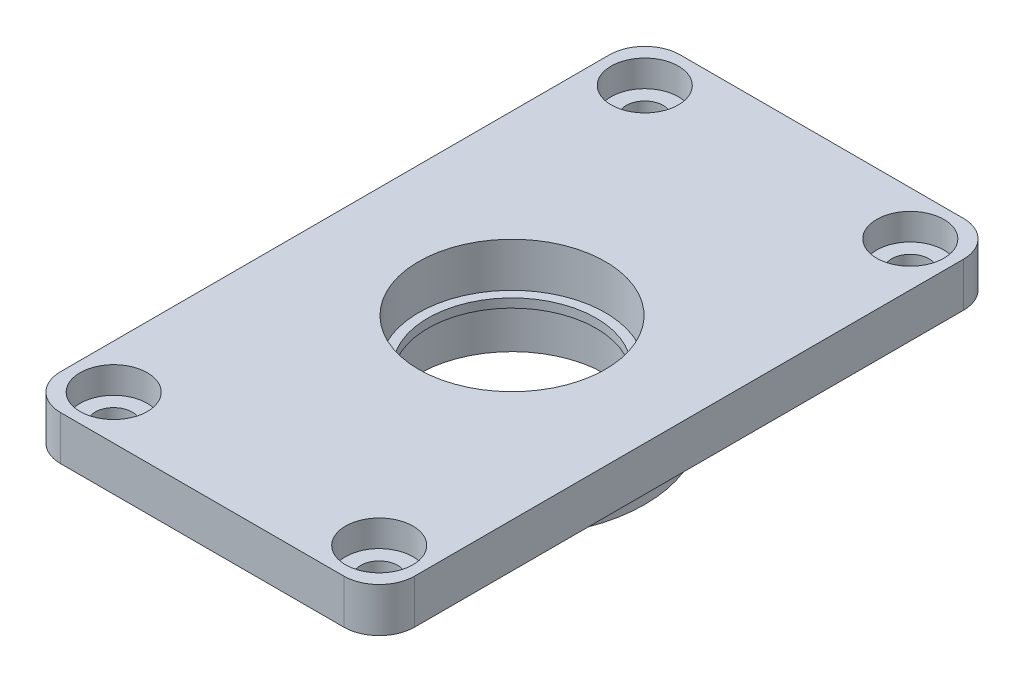
ISO-10303-21;
HEADER;
FILE_DESCRIPTION(('STEP AP214'),'2;1');
FILE_NAME('part.step','',(''),(''),'','','');
FILE_SCHEMA(('AUTOMOTIVE_DESIGN { 1 0 10303 214 1 1 1 1 }'));
ENDSEC;
DATA;
#1=APPLICATION_CONTEXT('core data for automotive mechanical design processes');
#2=APPLICATION_PROTOCOL_DEFINITION('international standard','automotive_design',2000,#1);
#3=PRODUCT_CONTEXT('',#1,'mechanical');
#4=PRODUCT('Part','Part','',(#3));
#5=PRODUCT_RELATED_PRODUCT_CATEGORY('part','',(#4));
#6=PRODUCT_DEFINITION_FORMATION('','',#4);
#7=PRODUCT_DEFINITION_CONTEXT('part definition',#1,'design');
#8=PRODUCT_DEFINITION('design','',#6,#7);
#9=PRODUCT_DEFINITION_SHAPE('','',#8);
#10=(LENGTH_UNIT() NAMED_UNIT(*) SI_UNIT(.MILLI.,.METRE.));
#11=(NAMED_UNIT(*) PLANE_ANGLE_UNIT() SI_UNIT($,.RADIAN.));
#12=(NAMED_UNIT(*) SI_UNIT($,.STERADIAN.) SOLID_ANGLE_UNIT());
#13=UNCERTAINTY_MEASURE_WITH_UNIT(LENGTH_MEASURE(1.E-05),#10,'distance_accuracy_value','');
#14=(GEOMETRIC_REPRESENTATION_CONTEXT(3) GLOBAL_UNCERTAINTY_ASSIGNED_CONTEXT((#13)) GLOBAL_UNIT_ASSIGNED_CONTEXT((#10,
#11,#12)) REPRESENTATION_CONTEXT('',''));
#15=CARTESIAN_POINT('',(0.,0.,0.));
#16=DIRECTION('',(0.,0.,1.));
#17=DIRECTION('',(1.,0.,0.));
#18=AXIS2_PLACEMENT_3D('',#15,#16,#17);
#19=CARTESIAN_POINT('',(15.,11.,-30.));
#20=DIRECTION('',(0.,-1.,0.));
#21=DIRECTION('',(0.,0.,-1.));
#22=AXIS2_PLACEMENT_3D('',#19,#20,#21);
#23=CYLINDRICAL_SURFACE('',#22,2.1);
#24=CARTESIAN_POINT('',(15.,6.00000000000001,-30.));
#25=DIRECTION('',(0.,1.,0.));
#26=DIRECTION('',(0.,0.,1.));
#27=AXIS2_PLACEMENT_3D('',#24,#25,#26);
#28=CIRCLE('',#27,2.1);
#29=CARTESIAN_POINT('',(15.,6.00000000000001,-27.9));
#30=VERTEX_POINT('',#29);
#31=EDGE_CURVE('E238',#30,#30,#28,.T.);
#32=ORIENTED_EDGE('',*,*,#31,.F.);
#33=EDGE_LOOP('',(#32));
#34=FACE_BOUND('',#33,.T.);
#35=CARTESIAN_POINT('',(15.,8.,-30.));
#36=DIRECTION('',(0.,1.,0.));
#37=DIRECTION('',(0.,0.,1.));
#38=AXIS2_PLACEMENT_3D('',#35,#36,#37);
#39=CIRCLE('',#38,2.1);
#40=CARTESIAN_POINT('',(15.,8.,-27.9));
#41=VERTEX_POINT('',#40);
#42=EDGE_CURVE('E180',#41,#41,#39,.T.);
#43=ORIENTED_EDGE('',*,*,#42,.T.);
#44=EDGE_LOOP('',(#43));
#45=FACE_BOUND('',#44,.T.);
#46=ADVANCED_FACE('F35',(#34,#45),#23,.F.);
#47=CARTESIAN_POINT('',(-15.,11.,-30.));
#48=DIRECTION('',(0.,-1.,0.));
#49=DIRECTION('',(0.,0.,-1.));
#50=AXIS2_PLACEMENT_3D('',#47,#48,#49);
#51=CYLINDRICAL_SURFACE('',#50,2.1);
#52=CARTESIAN_POINT('',(-15.,6.00000000000001,-30.));
#53=DIRECTION('',(0.,1.,0.));
#54=DIRECTION('',(0.,0.,1.));
#55=AXIS2_PLACEMENT_3D('',#52,#53,#54);
#56=CIRCLE('',#55,2.1);
#57=CARTESIAN_POINT('',(-15.,6.00000000000001,-27.9));
#58=VERTEX_POINT('',#57);
#59=EDGE_CURVE('E236',#58,#58,#56,.T.);
#60=ORIENTED_EDGE('',*,*,#59,.F.);
#61=EDGE_LOOP('',(#60));
#62=FACE_BOUND('',#61,.T.);
#63=CARTESIAN_POINT('',(-15.,8.,-30.));
#64=DIRECTION('',(0.,1.,0.));
#65=DIRECTION('',(0.,0.,1.));
#66=AXIS2_PLACEMENT_3D('',#63,#64,#65);
#67=CIRCLE('',#66,2.1);
#68=CARTESIAN_POINT('',(-15.,8.,-27.9));
#69=VERTEX_POINT('',#68);
#70=EDGE_CURVE('E177',#69,#69,#67,.T.);
#71=ORIENTED_EDGE('',*,*,#70,.T.);
#72=EDGE_LOOP('',(#71));
#73=FACE_BOUND('',#72,.T.);
#74=ADVANCED_FACE('F301',(#62,#73),#51,.F.);
#75=CARTESIAN_POINT('',(0.,0.,0.));
#76=DIRECTION('',(0.,1.,0.));
#77=DIRECTION('',(0.,0.,1.));
#78=AXIS2_PLACEMENT_3D('',#75,#76,#77);
#79=PLANE('',#78);
#80=CARTESIAN_POINT('',(0.,0.,0.));
#81=DIRECTION('',(0.,-1.,0.));
#82=DIRECTION('',(0.,0.,-1.));
#83=AXIS2_PLACEMENT_3D('',#80,#81,#82);
#84=CIRCLE('',#83,10.55);
#85=CARTESIAN_POINT('',(0.,0.,-10.55));
#86=VERTEX_POINT('',#85);
#87=EDGE_CURVE('E201',#86,#86,#84,.T.);
#88=ORIENTED_EDGE('',*,*,#87,.F.);
#89=EDGE_LOOP('',(#88));
#90=FACE_BOUND('',#89,.T.);
#91=CARTESIAN_POINT('',(0.,0.,0.));
#92=DIRECTION('',(0.,-1.,0.));
#93=DIRECTION('',(0.,0.,-1.));
#94=AXIS2_PLACEMENT_3D('',#91,#92,#93);
#95=CIRCLE('',#94,15.);
#96=CARTESIAN_POINT('',(0.,0.,-15.));
#97=VERTEX_POINT('',#96);
#98=EDGE_CURVE('E197',#97,#97,#95,.T.);
#99=ORIENTED_EDGE('',*,*,#98,.T.);
#100=EDGE_LOOP('',(#99));
#101=FACE_BOUND('',#100,.T.);
#102=ADVANCED_FACE('F308',(#90,#101),#79,.F.);
#103=CARTESIAN_POINT('',(0.,0.,0.));
#104=DIRECTION('',(0.,1.,0.));
#105=DIRECTION('',(0.,0.,1.));
#106=AXIS2_PLACEMENT_3D('',#103,#104,#105);
#107=CYLINDRICAL_SURFACE('',#106,9.5);
#108=CARTESIAN_POINT('',(0.,6.,0.));
#109=DIRECTION('',(0.,1.,0.));
#110=DIRECTION('',(0.,0.,1.));
#111=AXIS2_PLACEMENT_3D('',#108,#109,#110);
#112=CIRCLE('',#111,9.5);
#113=CARTESIAN_POINT('',(0.,6.,9.5));
#114=VERTEX_POINT('',#113);
#115=EDGE_CURVE('E161',#114,#114,#112,.F.);
#116=ORIENTED_EDGE('',*,*,#115,.F.);
#117=EDGE_LOOP('',(#116));
#118=FACE_BOUND('',#117,.T.);
#119=CARTESIAN_POINT('',(0.,5.,0.));
#120=DIRECTION('',(0.,-1.,0.));
#121=DIRECTION('',(0.,0.,-1.));
#122=AXIS2_PLACEMENT_3D('',#119,#120,#121);
#123=CIRCLE('',#122,9.5);
#124=CARTESIAN_POINT('',(0.,5.,-9.5));
#125=VERTEX_POINT('',#124);
#126=EDGE_CURVE('E173',#125,#125,#123,.F.);
#127=ORIENTED_EDGE('',*,*,#126,.F.);
#128=EDGE_LOOP('',(#127));
#129=FACE_BOUND('',#128,.T.);
#130=ADVANCED_FACE('F214',(#118,#129),#107,.F.);
#131=CARTESIAN_POINT('',(0.,11.,0.));
#132=DIRECTION('',(0.,1.,0.));
#133=DIRECTION('',(0.,0.,1.));
#134=AXIS2_PLACEMENT_3D('',#131,#132,#133);
#135=PLANE('',#134);
#136=CARTESIAN_POINT('',(-15.,11.,30.));
#137=DIRECTION('',(0.,1.,0.));
#138=DIRECTION('',(0.,0.,-1.));
#139=AXIS2_PLACEMENT_3D('',#136,#137,#138);
#140=CIRCLE('',#139,3.79999999999998);
#141=CARTESIAN_POINT('',(-15.,11.,26.2));
#142=VERTEX_POINT('',#141);
#143=EDGE_CURVE('E256',#142,#142,#140,.T.);
#144=ORIENTED_EDGE('',*,*,#143,.F.);
#145=EDGE_LOOP('',(#144));
#146=FACE_BOUND('',#145,.T.);
#147=CARTESIAN_POINT('',(15.,11.,30.));
#148=DIRECTION('',(0.,1.,0.));
#149=DIRECTION('',(0.,0.,-1.));
#150=AXIS2_PLACEMENT_3D('',#147,#148,#149);
#151=CIRCLE('',#150,3.79999999999999);
#152=CARTESIAN_POINT('',(15.,11.,26.2));
#153=VERTEX_POINT('',#152);
#154=EDGE_CURVE('E262',#153,#153,#151,.T.);
#155=ORIENTED_EDGE('',*,*,#154,.F.);
#156=EDGE_LOOP('',(#155));
#157=FACE_BOUND('',#156,.T.);
#158=CARTESIAN_POINT('',(15.,11.,-30.));
#159=DIRECTION('',(0.,1.,0.));
#160=DIRECTION('',(0.,0.,1.));
#161=AXIS2_PLACEMENT_3D('',#158,#159,#160);
#162=CIRCLE('',#161,3.8);
#163=CARTESIAN_POINT('',(15.,11.,-26.2));
#164=VERTEX_POINT('',#163);
#165=EDGE_CURVE('E268',#164,#164,#162,.T.);
#166=ORIENTED_EDGE('',*,*,#165,.F.);
#167=EDGE_LOOP('',(#166));
#168=FACE_BOUND('',#167,.T.);
#169=CARTESIAN_POINT('',(-15.,11.,-30.));
#170=DIRECTION('',(0.,1.,0.));
#171=DIRECTION('',(0.,0.,1.));
#172=AXIS2_PLACEMENT_3D('',#169,#170,#171);
#173=CIRCLE('',#172,3.8);
#174=CARTESIAN_POINT('',(-15.,11.,-26.2));
#175=VERTEX_POINT('',#174);
#176=EDGE_CURVE('E250',#175,#175,#173,.T.);
#177=ORIENTED_EDGE('',*,*,#176,.F.);
#178=EDGE_LOOP('',(#177));
#179=FACE_BOUND('',#178,.T.);
#180=CARTESIAN_POINT('',(0.,11.,0.));
#181=DIRECTION('',(0.,1.,0.));
#182=DIRECTION('',(0.,0.,1.));
#183=AXIS2_PLACEMENT_3D('',#180,#181,#182);
#184=CIRCLE('',#183,10.55);
#185=CARTESIAN_POINT('',(0.,11.,10.55));
#186=VERTEX_POINT('',#185);
#187=EDGE_CURVE('E168',#186,#186,#184,.T.);
#188=ORIENTED_EDGE('',*,*,#187,.F.);
#189=EDGE_LOOP('',(#188));
#190=FACE_BOUND('',#189,.T.);
#191=DIRECTION('',(0.,0.,1.));
#192=VECTOR('',#191,1.);
#193=CARTESIAN_POINT('',(-20.,11.,-35.));
#194=LINE('',#193,#192);
#195=CARTESIAN_POINT('',(-20.,11.,-31.));
#196=VERTEX_POINT('',#195);
#197=CARTESIAN_POINT('',(-20.,11.,31.));
#198=VERTEX_POINT('',#197);
#199=EDGE_CURVE('E132',#196,#198,#194,.T.);
#200=ORIENTED_EDGE('',*,*,#199,.T.);
#201=CARTESIAN_POINT('',(-16.,11.,31.));
#202=DIRECTION('',(0.,1.,0.));
#203=DIRECTION('',(0.,0.,1.));
#204=AXIS2_PLACEMENT_3D('',#201,#202,#203);
#205=CIRCLE('',#204,4.);
#206=CARTESIAN_POINT('',(-16.,11.,35.));
#207=VERTEX_POINT('',#206);
#208=EDGE_CURVE('E150',#198,#207,#205,.T.);
#209=ORIENTED_EDGE('',*,*,#208,.T.);
#210=DIRECTION('',(1.,0.,0.));
#211=VECTOR('',#210,1.);
#212=CARTESIAN_POINT('',(-20.,11.,35.));
#213=LINE('',#212,#211);
#214=CARTESIAN_POINT('',(16.,11.,35.));
#215=VERTEX_POINT('',#214);
#216=EDGE_CURVE('E128',#207,#215,#213,.T.);
#217=ORIENTED_EDGE('',*,*,#216,.T.);
#218=CARTESIAN_POINT('',(16.,11.,31.));
#219=DIRECTION('',(0.,1.,0.));
#220=DIRECTION('',(0.,0.,1.));
#221=AXIS2_PLACEMENT_3D('',#218,#219,#220);
#222=CIRCLE('',#221,4.);
#223=CARTESIAN_POINT('',(20.,11.,31.));
#224=VERTEX_POINT('',#223);
#225=EDGE_CURVE('E127',#215,#224,#222,.T.);
#226=ORIENTED_EDGE('',*,*,#225,.T.);
#227=DIRECTION('',(0.,0.,-1.));
#228=VECTOR('',#227,1.);
#229=CARTESIAN_POINT('',(20.,11.,-35.));
#230=LINE('',#229,#228);
#231=CARTESIAN_POINT('',(20.,11.,-31.));
#232=VERTEX_POINT('',#231);
#233=EDGE_CURVE('E159',#224,#232,#230,.T.);
#234=ORIENTED_EDGE('',*,*,#233,.T.);
#235=CARTESIAN_POINT('',(16.,11.,-31.));
#236=DIRECTION('',(0.,1.,0.));
#237=DIRECTION('',(0.,0.,1.));
#238=AXIS2_PLACEMENT_3D('',#235,#236,#237);
#239=CIRCLE('',#238,4.);
#240=CARTESIAN_POINT('',(16.,11.,-35.));
#241=VERTEX_POINT('',#240);
#242=EDGE_CURVE('E56',#232,#241,#239,.T.);
#243=ORIENTED_EDGE('',*,*,#242,.T.);
#244=DIRECTION('',(-1.,0.,0.));
#245=VECTOR('',#244,1.);
#246=CARTESIAN_POINT('',(-20.,11.,-35.));
#247=LINE('',#246,#245);
#248=CARTESIAN_POINT('',(-16.,11.,-35.));
#249=VERTEX_POINT('',#248);
#250=EDGE_CURVE('E160',#241,#249,#247,.T.);
#251=ORIENTED_EDGE('',*,*,#250,.T.);
#252=CARTESIAN_POINT('',(-16.,11.,-31.));
#253=DIRECTION('',(0.,1.,0.));
#254=DIRECTION('',(0.,0.,1.));
#255=AXIS2_PLACEMENT_3D('',#252,#253,#254);
#256=CIRCLE('',#255,4.);
#257=EDGE_CURVE('E146',#249,#196,#256,.T.);
#258=ORIENTED_EDGE('',*,*,#257,.T.);
#259=EDGE_LOOP('',(#200,#209,#217,#226,#234,#243,#251,#258));
#260=FACE_BOUND('',#259,.T.);
#261=ADVANCED_FACE('F212',(#146,#157,#168,#179,#190,#260),#135,.T.);
#262=CARTESIAN_POINT('',(20.,11.,-35.));
#263=DIRECTION('',(-1.,0.,0.));
#264=DIRECTION('',(0.,0.,1.));
#265=AXIS2_PLACEMENT_3D('',#262,#263,#264);
#266=PLANE('',#265);
#267=ORIENTED_EDGE('',*,*,#233,.F.);
#268=DIRECTION('',(0.,-1.,0.));
#269=VECTOR('',#268,1.);
#270=CARTESIAN_POINT('',(20.,11.,31.));
#271=LINE('',#270,#269);
#272=CARTESIAN_POINT('',(20.,6.00000000000001,31.));
#273=VERTEX_POINT('',#272);
#274=EDGE_CURVE('E154',#224,#273,#271,.T.);
#275=ORIENTED_EDGE('',*,*,#274,.T.);
#276=DIRECTION('',(0.,0.,1.));
#277=VECTOR('',#276,1.);
#278=CARTESIAN_POINT('',(20.,6.00000000000001,0.));
#279=LINE('',#278,#277);
#280=CARTESIAN_POINT('',(20.,6.00000000000001,-31.));
#281=VERTEX_POINT('',#280);
#282=EDGE_CURVE('E107',#281,#273,#279,.T.);
#283=ORIENTED_EDGE('',*,*,#282,.F.);
#284=DIRECTION('',(0.,-1.,0.));
#285=VECTOR('',#284,1.);
#286=CARTESIAN_POINT('',(20.,11.,-31.));
#287=LINE('',#286,#285);
#288=EDGE_CURVE('E152',#281,#232,#287,.F.);
#289=ORIENTED_EDGE('',*,*,#288,.T.);
#290=EDGE_LOOP('',(#267,#275,#283,#289));
#291=FACE_BOUND('',#290,.T.);
#292=ADVANCED_FACE('F157',(#291),#266,.F.);
#293=CARTESIAN_POINT('',(-20.,11.,-35.));
#294=DIRECTION('',(0.,0.,1.));
#295=DIRECTION('',(1.,0.,0.));
#296=AXIS2_PLACEMENT_3D('',#293,#294,#295);
#297=PLANE('',#296);
#298=ORIENTED_EDGE('',*,*,#250,.F.);
#299=DIRECTION('',(0.,-1.,0.));
#300=VECTOR('',#299,1.);
#301=CARTESIAN_POINT('',(16.,11.,-35.));
#302=LINE('',#301,#300);
#303=CARTESIAN_POINT('',(16.,6.00000000000001,-35.));
#304=VERTEX_POINT('',#303);
#305=EDGE_CURVE('E11',#241,#304,#302,.T.);
#306=ORIENTED_EDGE('',*,*,#305,.T.);
#307=DIRECTION('',(1.,0.,0.));
#308=VECTOR('',#307,1.);
#309=CARTESIAN_POINT('',(0.,6.00000000000001,-35.));
#310=LINE('',#309,#308);
#311=CARTESIAN_POINT('',(-16.,6.00000000000001,-35.));
#312=VERTEX_POINT('',#311);
#313=EDGE_CURVE('E228',#312,#304,#310,.T.);
#314=ORIENTED_EDGE('',*,*,#313,.F.);
#315=DIRECTION('',(0.,-1.,0.));
#316=VECTOR('',#315,1.);
#317=CARTESIAN_POINT('',(-16.,11.,-35.));
#318=LINE('',#317,#316);
#319=EDGE_CURVE('E43',#312,#249,#318,.F.);
#320=ORIENTED_EDGE('',*,*,#319,.T.);
#321=EDGE_LOOP('',(#298,#306,#314,#320));
#322=FACE_BOUND('',#321,.T.);
#323=ADVANCED_FACE('F330',(#322),#297,.F.);
#324=CARTESIAN_POINT('',(-20.,11.,-35.));
#325=DIRECTION('',(1.,0.,0.));
#326=DIRECTION('',(0.,0.,-1.));
#327=AXIS2_PLACEMENT_3D('',#324,#325,#326);
#328=PLANE('',#327);
#329=DIRECTION('',(0.,0.,-1.));
#330=VECTOR('',#329,1.);
#331=CARTESIAN_POINT('',(-20.,6.00000000000001,0.));
#332=LINE('',#331,#330);
#333=CARTESIAN_POINT('',(-20.,6.00000000000001,31.));
#334=VERTEX_POINT('',#333);
#335=CARTESIAN_POINT('',(-20.,6.00000000000001,-31.));
#336=VERTEX_POINT('',#335);
#337=EDGE_CURVE('E123',#334,#336,#332,.T.);
#338=ORIENTED_EDGE('',*,*,#337,.F.);
#339=DIRECTION('',(0.,-1.,0.));
#340=VECTOR('',#339,1.);
#341=CARTESIAN_POINT('',(-20.,11.,31.));
#342=LINE('',#341,#340);
#343=EDGE_CURVE('E144',#334,#198,#342,.F.);
#344=ORIENTED_EDGE('',*,*,#343,.T.);
#345=ORIENTED_EDGE('',*,*,#199,.F.);
#346=DIRECTION('',(0.,-1.,0.));
#347=VECTOR('',#346,1.);
#348=CARTESIAN_POINT('',(-20.,11.,-31.));
#349=LINE('',#348,#347);
#350=EDGE_CURVE('E141',#196,#336,#349,.T.);
#351=ORIENTED_EDGE('',*,*,#350,.T.);
#352=EDGE_LOOP('',(#338,#344,#345,#351));
#353=FACE_BOUND('',#352,.T.);
#354=ADVANCED_FACE('F227',(#353),#328,.F.);
#355=CARTESIAN_POINT('',(-20.,11.,35.));
#356=DIRECTION('',(0.,0.,-1.));
#357=DIRECTION('',(-1.,0.,0.));
#358=AXIS2_PLACEMENT_3D('',#355,#356,#357);
#359=PLANE('',#358);
#360=ORIENTED_EDGE('',*,*,#216,.F.);
#361=DIRECTION('',(0.,-1.,0.));
#362=VECTOR('',#361,1.);
#363=CARTESIAN_POINT('',(-16.,11.,35.));
#364=LINE('',#363,#362);
#365=CARTESIAN_POINT('',(-16.,6.00000000000001,35.));
#366=VERTEX_POINT('',#365);
#367=EDGE_CURVE('E122',#207,#366,#364,.T.);
#368=ORIENTED_EDGE('',*,*,#367,.T.);
#369=DIRECTION('',(-1.,0.,0.));
#370=VECTOR('',#369,1.);
#371=CARTESIAN_POINT('',(0.,6.00000000000001,35.));
#372=LINE('',#371,#370);
#373=CARTESIAN_POINT('',(16.,6.00000000000001,35.));
#374=VERTEX_POINT('',#373);
#375=EDGE_CURVE('E105',#374,#366,#372,.T.);
#376=ORIENTED_EDGE('',*,*,#375,.F.);
#377=DIRECTION('',(0.,-1.,0.));
#378=VECTOR('',#377,1.);
#379=CARTESIAN_POINT('',(16.,11.,35.));
#380=LINE('',#379,#378);
#381=EDGE_CURVE('E119',#374,#215,#380,.F.);
#382=ORIENTED_EDGE('',*,*,#381,.T.);
#383=EDGE_LOOP('',(#360,#368,#376,#382));
#384=FACE_BOUND('',#383,.T.);
#385=ADVANCED_FACE('F118',(#384),#359,.F.);
#386=CARTESIAN_POINT('',(-15.,11.,30.));
#387=DIRECTION('',(0.,-1.,0.));
#388=DIRECTION('',(0.,0.,-1.));
#389=AXIS2_PLACEMENT_3D('',#386,#387,#388);
#390=CYLINDRICAL_SURFACE('',#389,2.1);
#391=CARTESIAN_POINT('',(-15.,8.,30.));
#392=DIRECTION('',(0.,-1.,0.));
#393=DIRECTION('',(0.,0.,-1.));
#394=AXIS2_PLACEMENT_3D('',#391,#392,#393);
#395=CIRCLE('',#394,2.1);
#396=CARTESIAN_POINT('',(-15.,8.,27.9));
#397=VERTEX_POINT('',#396);
#398=EDGE_CURVE('E135',#397,#397,#395,.T.);
#399=ORIENTED_EDGE('',*,*,#398,.F.);
#400=EDGE_LOOP('',(#399));
#401=FACE_BOUND('',#400,.T.);
#402=CARTESIAN_POINT('',(-15.,6.00000000000001,30.));
#403=DIRECTION('',(0.,1.,0.));
#404=DIRECTION('',(0.,0.,1.));
#405=AXIS2_PLACEMENT_3D('',#402,#403,#404);
#406=CIRCLE('',#405,2.1);
#407=CARTESIAN_POINT('',(-15.,6.00000000000001,32.1));
#408=VERTEX_POINT('',#407);
#409=EDGE_CURVE('E188',#408,#408,#406,.T.);
#410=ORIENTED_EDGE('',*,*,#409,.F.);
#411=EDGE_LOOP('',(#410));
#412=FACE_BOUND('',#411,.T.);
#413=ADVANCED_FACE('F318',(#401,#412),#390,.F.);
#414=CARTESIAN_POINT('',(15.,11.,30.));
#415=DIRECTION('',(0.,-1.,0.));
#416=DIRECTION('',(0.,0.,-1.));
#417=AXIS2_PLACEMENT_3D('',#414,#415,#416);
#418=CYLINDRICAL_SURFACE('',#417,2.1);
#419=CARTESIAN_POINT('',(15.,8.,30.));
#420=DIRECTION('',(0.,-1.,0.));
#421=DIRECTION('',(0.,0.,-1.));
#422=AXIS2_PLACEMENT_3D('',#419,#420,#421);
#423=CIRCLE('',#422,2.1);
#424=CARTESIAN_POINT('',(15.,8.,27.9));
#425=VERTEX_POINT('',#424);
#426=EDGE_CURVE('E183',#425,#425,#423,.T.);
#427=ORIENTED_EDGE('',*,*,#426,.F.);
#428=EDGE_LOOP('',(#427));
#429=FACE_BOUND('',#428,.T.);
#430=CARTESIAN_POINT('',(15.,6.00000000000001,30.));
#431=DIRECTION('',(0.,1.,0.));
#432=DIRECTION('',(0.,0.,1.));
#433=AXIS2_PLACEMENT_3D('',#430,#431,#432);
#434=CIRCLE('',#433,2.1);
#435=CARTESIAN_POINT('',(15.,6.00000000000001,32.1));
#436=VERTEX_POINT('',#435);
#437=EDGE_CURVE('E231',#436,#436,#434,.T.);
#438=ORIENTED_EDGE('',*,*,#437,.F.);
#439=EDGE_LOOP('',(#438));
#440=FACE_BOUND('',#439,.T.);
#441=ADVANCED_FACE('F314',(#429,#440),#418,.F.);
#442=CARTESIAN_POINT('',(0.,6.,0.));
#443=DIRECTION('',(0.,1.,0.));
#444=DIRECTION('',(0.,0.,1.));
#445=AXIS2_PLACEMENT_3D('',#442,#443,#444);
#446=PLANE('',#445);
#447=CARTESIAN_POINT('',(0.,6.,0.));
#448=DIRECTION('',(0.,1.,0.));
#449=DIRECTION('',(0.,0.,1.));
#450=AXIS2_PLACEMENT_3D('',#447,#448,#449);
#451=CIRCLE('',#450,10.55);
#452=CARTESIAN_POINT('',(0.,6.,10.55));
#453=VERTEX_POINT('',#452);
#454=EDGE_CURVE('E165',#453,#453,#451,.T.);
#455=ORIENTED_EDGE('',*,*,#454,.T.);
#456=EDGE_LOOP('',(#455));
#457=FACE_BOUND('',#456,.T.);
#458=ORIENTED_EDGE('',*,*,#115,.T.);
#459=EDGE_LOOP('',(#458));
#460=FACE_BOUND('',#459,.T.);
#461=ADVANCED_FACE('F317',(#457,#460),#446,.T.);
#462=CARTESIAN_POINT('',(0.,6.,0.));
#463=DIRECTION('',(0.,1.,0.));
#464=DIRECTION('',(0.,0.,1.));
#465=AXIS2_PLACEMENT_3D('',#462,#463,#464);
#466=CYLINDRICAL_SURFACE('',#465,10.55);
#467=ORIENTED_EDGE('',*,*,#454,.F.);
#468=EDGE_LOOP('',(#467));
#469=FACE_BOUND('',#468,.T.);
#470=ORIENTED_EDGE('',*,*,#187,.T.);
#471=EDGE_LOOP('',(#470));
#472=FACE_BOUND('',#471,.T.);
#473=ADVANCED_FACE('F210',(#469,#472),#466,.F.);
#474=CARTESIAN_POINT('',(0.,5.,0.));
#475=DIRECTION('',(0.,-1.,0.));
#476=DIRECTION('',(0.,0.,-1.));
#477=AXIS2_PLACEMENT_3D('',#474,#475,#476);
#478=PLANE('',#477);
#479=CARTESIAN_POINT('',(0.,5.,0.));
#480=DIRECTION('',(0.,-1.,0.));
#481=DIRECTION('',(0.,0.,-1.));
#482=AXIS2_PLACEMENT_3D('',#479,#480,#481);
#483=CIRCLE('',#482,10.55);
#484=CARTESIAN_POINT('',(0.,5.,-10.55));
#485=VERTEX_POINT('',#484);
#486=EDGE_CURVE('E176',#485,#485,#483,.T.);
#487=ORIENTED_EDGE('',*,*,#486,.T.);
#488=EDGE_LOOP('',(#487));
#489=FACE_BOUND('',#488,.T.);
#490=ORIENTED_EDGE('',*,*,#126,.T.);
#491=EDGE_LOOP('',(#490));
#492=FACE_BOUND('',#491,.T.);
#493=ADVANCED_FACE('F496',(#489,#492),#478,.T.);
#494=CARTESIAN_POINT('',(0.,5.,0.));
#495=DIRECTION('',(0.,-1.,0.));
#496=DIRECTION('',(0.,0.,-1.));
#497=AXIS2_PLACEMENT_3D('',#494,#495,#496);
#498=CYLINDRICAL_SURFACE('',#497,10.55);
#499=ORIENTED_EDGE('',*,*,#486,.F.);
#500=EDGE_LOOP('',(#499));
#501=FACE_BOUND('',#500,.T.);
#502=ORIENTED_EDGE('',*,*,#87,.T.);
#503=EDGE_LOOP('',(#502));
#504=FACE_BOUND('',#503,.T.);
#505=ADVANCED_FACE('F481',(#501,#504),#498,.F.);
#506=CARTESIAN_POINT('',(0.,86.6225774829855,0.));
#507=DIRECTION('',(0.,-1.,0.));
#508=DIRECTION('',(0.,0.,-1.));
#509=AXIS2_PLACEMENT_3D('',#506,#507,#508);
#510=CYLINDRICAL_SURFACE('',#509,15.);
#511=ORIENTED_EDGE('',*,*,#98,.F.);
#512=EDGE_LOOP('',(#511));
#513=FACE_BOUND('',#512,.T.);
#514=CARTESIAN_POINT('',(0.,6.00000000000001,0.));
#515=DIRECTION('',(0.,1.,0.));
#516=DIRECTION('',(0.,0.,1.));
#517=AXIS2_PLACEMENT_3D('',#514,#515,#516);
#518=CIRCLE('',#517,15.);
#519=CARTESIAN_POINT('',(0.,6.00000000000001,15.));
#520=VERTEX_POINT('',#519);
#521=EDGE_CURVE('E203',#520,#520,#518,.F.);
#522=ORIENTED_EDGE('',*,*,#521,.T.);
#523=EDGE_LOOP('',(#522));
#524=FACE_BOUND('',#523,.T.);
#525=ADVANCED_FACE('F297',(#513,#524),#510,.T.);
#526=CARTESIAN_POINT('',(0.,6.,0.));
#527=DIRECTION('',(0.,1.,0.));
#528=DIRECTION('',(0.,0.,1.));
#529=AXIS2_PLACEMENT_3D('',#526,#527,#528);
#530=PLANE('',#529);
#531=ORIENTED_EDGE('',*,*,#31,.T.);
#532=EDGE_LOOP('',(#531));
#533=FACE_BOUND('',#532,.T.);
#534=ORIENTED_EDGE('',*,*,#59,.T.);
#535=EDGE_LOOP('',(#534));
#536=FACE_BOUND('',#535,.T.);
#537=ORIENTED_EDGE('',*,*,#437,.T.);
#538=EDGE_LOOP('',(#537));
#539=FACE_BOUND('',#538,.T.);
#540=ORIENTED_EDGE('',*,*,#375,.T.);
#541=CARTESIAN_POINT('',(-16.,6.,31.));
#542=DIRECTION('',(0.,1.,0.));
#543=DIRECTION('',(0.,0.,1.));
#544=AXIS2_PLACEMENT_3D('',#541,#542,#543);
#545=CIRCLE('',#544,4.);
#546=EDGE_CURVE('E112',#366,#334,#545,.F.);
#547=ORIENTED_EDGE('',*,*,#546,.T.);
#548=ORIENTED_EDGE('',*,*,#337,.T.);
#549=CARTESIAN_POINT('',(-16.,6.,-31.));
#550=DIRECTION('',(0.,1.,0.));
#551=DIRECTION('',(0.,0.,1.));
#552=AXIS2_PLACEMENT_3D('',#549,#550,#551);
#553=CIRCLE('',#552,4.);
#554=EDGE_CURVE('E130',#336,#312,#553,.F.);
#555=ORIENTED_EDGE('',*,*,#554,.T.);
#556=ORIENTED_EDGE('',*,*,#313,.T.);
#557=CARTESIAN_POINT('',(16.,6.,-31.));
#558=DIRECTION('',(0.,1.,0.));
#559=DIRECTION('',(0.,0.,1.));
#560=AXIS2_PLACEMENT_3D('',#557,#558,#559);
#561=CIRCLE('',#560,4.);
#562=EDGE_CURVE('E113',#304,#281,#561,.F.);
#563=ORIENTED_EDGE('',*,*,#562,.T.);
#564=ORIENTED_EDGE('',*,*,#282,.T.);
#565=CARTESIAN_POINT('',(16.,6.,31.));
#566=DIRECTION('',(0.,1.,0.));
#567=DIRECTION('',(0.,0.,1.));
#568=AXIS2_PLACEMENT_3D('',#565,#566,#567);
#569=CIRCLE('',#568,4.);
#570=EDGE_CURVE('E101',#273,#374,#569,.F.);
#571=ORIENTED_EDGE('',*,*,#570,.T.);
#572=EDGE_LOOP('',(#540,#547,#548,#555,#556,#563,#564,#571));
#573=FACE_BOUND('',#572,.T.);
#574=ORIENTED_EDGE('',*,*,#409,.T.);
#575=EDGE_LOOP('',(#574));
#576=FACE_BOUND('',#575,.T.);
#577=ORIENTED_EDGE('',*,*,#521,.F.);
#578=EDGE_LOOP('',(#577));
#579=FACE_BOUND('',#578,.T.);
#580=ADVANCED_FACE('F103',(#533,#536,#539,#573,#576,#579),#530,.F.);
#581=CARTESIAN_POINT('',(-15.,8.,-30.));
#582=DIRECTION('',(0.,1.,0.));
#583=DIRECTION('',(0.,0.,1.));
#584=AXIS2_PLACEMENT_3D('',#581,#582,#583);
#585=CYLINDRICAL_SURFACE('',#584,3.8);
#586=CARTESIAN_POINT('',(-15.,8.,-30.));
#587=DIRECTION('',(0.,1.,0.));
#588=DIRECTION('',(0.,0.,1.));
#589=AXIS2_PLACEMENT_3D('',#586,#587,#588);
#590=CIRCLE('',#589,3.8);
#591=CARTESIAN_POINT('',(-15.,8.,-26.2));
#592=VERTEX_POINT('',#591);
#593=EDGE_CURVE('E181',#592,#592,#590,.T.);
#594=ORIENTED_EDGE('',*,*,#593,.F.);
#595=EDGE_LOOP('',(#594));
#596=FACE_BOUND('',#595,.T.);
#597=ORIENTED_EDGE('',*,*,#176,.T.);
#598=EDGE_LOOP('',(#597));
#599=FACE_BOUND('',#598,.T.);
#600=ADVANCED_FACE('F286',(#596,#599),#585,.F.);
#601=CARTESIAN_POINT('',(-15.,8.,-30.));
#602=DIRECTION('',(0.,1.,0.));
#603=DIRECTION('',(0.,0.,1.));
#604=AXIS2_PLACEMENT_3D('',#601,#602,#603);
#605=PLANE('',#604);
#606=ORIENTED_EDGE('',*,*,#70,.F.);
#607=EDGE_LOOP('',(#606));
#608=FACE_BOUND('',#607,.T.);
#609=ORIENTED_EDGE('',*,*,#593,.T.);
#610=EDGE_LOOP('',(#609));
#611=FACE_BOUND('',#610,.T.);
#612=ADVANCED_FACE('F279',(#608,#611),#605,.T.);
#613=CARTESIAN_POINT('',(15.,8.,-30.));
#614=DIRECTION('',(0.,1.,0.));
#615=DIRECTION('',(0.,0.,1.));
#616=AXIS2_PLACEMENT_3D('',#613,#614,#615);
#617=CYLINDRICAL_SURFACE('',#616,3.8);
#618=CARTESIAN_POINT('',(15.,8.,-30.));
#619=DIRECTION('',(0.,1.,0.));
#620=DIRECTION('',(0.,0.,1.));
#621=AXIS2_PLACEMENT_3D('',#618,#619,#620);
#622=CIRCLE('',#621,3.8);
#623=CARTESIAN_POINT('',(15.,8.,-26.2));
#624=VERTEX_POINT('',#623);
#625=EDGE_CURVE('E253',#624,#624,#622,.T.);
#626=ORIENTED_EDGE('',*,*,#625,.F.);
#627=EDGE_LOOP('',(#626));
#628=FACE_BOUND('',#627,.T.);
#629=ORIENTED_EDGE('',*,*,#165,.T.);
#630=EDGE_LOOP('',(#629));
#631=FACE_BOUND('',#630,.T.);
#632=ADVANCED_FACE('F276',(#628,#631),#617,.F.);
#633=CARTESIAN_POINT('',(15.,8.,-30.));
#634=DIRECTION('',(0.,1.,0.));
#635=DIRECTION('',(0.,0.,1.));
#636=AXIS2_PLACEMENT_3D('',#633,#634,#635);
#637=PLANE('',#636);
#638=ORIENTED_EDGE('',*,*,#42,.F.);
#639=EDGE_LOOP('',(#638));
#640=FACE_BOUND('',#639,.T.);
#641=ORIENTED_EDGE('',*,*,#625,.T.);
#642=EDGE_LOOP('',(#641));
#643=FACE_BOUND('',#642,.T.);
#644=ADVANCED_FACE('F274',(#640,#643),#637,.T.);
#645=CARTESIAN_POINT('',(15.,8.,30.));
#646=DIRECTION('',(0.,1.,0.));
#647=DIRECTION('',(0.,0.,1.));
#648=AXIS2_PLACEMENT_3D('',#645,#646,#647);
#649=CYLINDRICAL_SURFACE('',#648,3.79999999999999);
#650=CARTESIAN_POINT('',(15.,8.,30.));
#651=DIRECTION('',(0.,1.,0.));
#652=DIRECTION('',(0.,0.,-1.));
#653=AXIS2_PLACEMENT_3D('',#650,#651,#652);
#654=CIRCLE('',#653,3.79999999999999);
#655=CARTESIAN_POINT('',(15.,8.,26.2));
#656=VERTEX_POINT('',#655);
#657=EDGE_CURVE('E265',#656,#656,#654,.T.);
#658=ORIENTED_EDGE('',*,*,#657,.F.);
#659=EDGE_LOOP('',(#658));
#660=FACE_BOUND('',#659,.T.);
#661=ORIENTED_EDGE('',*,*,#154,.T.);
#662=EDGE_LOOP('',(#661));
#663=FACE_BOUND('',#662,.T.);
#664=ADVANCED_FACE('F421',(#660,#663),#649,.F.);
#665=CARTESIAN_POINT('',(15.,8.,30.));
#666=DIRECTION('',(0.,-1.,0.));
#667=DIRECTION('',(0.,0.,-1.));
#668=AXIS2_PLACEMENT_3D('',#665,#666,#667);
#669=PLANE('',#668);
#670=ORIENTED_EDGE('',*,*,#426,.T.);
#671=EDGE_LOOP('',(#670));
#672=FACE_BOUND('',#671,.T.);
#673=ORIENTED_EDGE('',*,*,#657,.T.);
#674=EDGE_LOOP('',(#673));
#675=FACE_BOUND('',#674,.T.);
#676=ADVANCED_FACE('F411',(#672,#675),#669,.F.);
#677=CARTESIAN_POINT('',(-15.,8.,30.));
#678=DIRECTION('',(0.,1.,0.));
#679=DIRECTION('',(0.,0.,1.));
#680=AXIS2_PLACEMENT_3D('',#677,#678,#679);
#681=CYLINDRICAL_SURFACE('',#680,3.79999999999998);
#682=CARTESIAN_POINT('',(-15.,8.,30.));
#683=DIRECTION('',(0.,1.,0.));
#684=DIRECTION('',(0.,0.,-1.));
#685=AXIS2_PLACEMENT_3D('',#682,#683,#684);
#686=CIRCLE('',#685,3.79999999999998);
#687=CARTESIAN_POINT('',(-15.,8.,26.2));
#688=VERTEX_POINT('',#687);
#689=EDGE_CURVE('E259',#688,#688,#686,.T.);
#690=ORIENTED_EDGE('',*,*,#689,.F.);
#691=EDGE_LOOP('',(#690));
#692=FACE_BOUND('',#691,.T.);
#693=ORIENTED_EDGE('',*,*,#143,.T.);
#694=EDGE_LOOP('',(#693));
#695=FACE_BOUND('',#694,.T.);
#696=ADVANCED_FACE('F402',(#692,#695),#681,.F.);
#697=CARTESIAN_POINT('',(-15.,8.,30.));
#698=DIRECTION('',(0.,-1.,0.));
#699=DIRECTION('',(0.,0.,-1.));
#700=AXIS2_PLACEMENT_3D('',#697,#698,#699);
#701=PLANE('',#700);
#702=ORIENTED_EDGE('',*,*,#398,.T.);
#703=EDGE_LOOP('',(#702));
#704=FACE_BOUND('',#703,.T.);
#705=ORIENTED_EDGE('',*,*,#689,.T.);
#706=EDGE_LOOP('',(#705));
#707=FACE_BOUND('',#706,.T.);
#708=ADVANCED_FACE('F337',(#704,#707),#701,.F.);
#709=CARTESIAN_POINT('',(-16.,11.,31.));
#710=DIRECTION('',(0.,-1.,0.));
#711=DIRECTION('',(0.,0.,-1.));
#712=AXIS2_PLACEMENT_3D('',#709,#710,#711);
#713=CYLINDRICAL_SURFACE('',#712,4.);
#714=ORIENTED_EDGE('',*,*,#208,.F.);
#715=ORIENTED_EDGE('',*,*,#343,.F.);
#716=ORIENTED_EDGE('',*,*,#546,.F.);
#717=ORIENTED_EDGE('',*,*,#367,.F.);
#718=EDGE_LOOP('',(#714,#715,#716,#717));
#719=FACE_BOUND('',#718,.T.);
#720=ADVANCED_FACE('F224',(#719),#713,.T.);
#721=CARTESIAN_POINT('',(16.,11.,31.));
#722=DIRECTION('',(0.,-1.,0.));
#723=DIRECTION('',(0.,0.,-1.));
#724=AXIS2_PLACEMENT_3D('',#721,#722,#723);
#725=CYLINDRICAL_SURFACE('',#724,4.);
#726=ORIENTED_EDGE('',*,*,#225,.F.);
#727=ORIENTED_EDGE('',*,*,#381,.F.);
#728=ORIENTED_EDGE('',*,*,#570,.F.);
#729=ORIENTED_EDGE('',*,*,#274,.F.);
#730=EDGE_LOOP('',(#726,#727,#728,#729));
#731=FACE_BOUND('',#730,.T.);
#732=ADVANCED_FACE('F126',(#731),#725,.T.);
#733=CARTESIAN_POINT('',(16.,11.,-31.));
#734=DIRECTION('',(0.,-1.,0.));
#735=DIRECTION('',(0.,0.,-1.));
#736=AXIS2_PLACEMENT_3D('',#733,#734,#735);
#737=CYLINDRICAL_SURFACE('',#736,4.);
#738=ORIENTED_EDGE('',*,*,#242,.F.);
#739=ORIENTED_EDGE('',*,*,#288,.F.);
#740=ORIENTED_EDGE('',*,*,#562,.F.);
#741=ORIENTED_EDGE('',*,*,#305,.F.);
#742=EDGE_LOOP('',(#738,#739,#740,#741));
#743=FACE_BOUND('',#742,.T.);
#744=ADVANCED_FACE('F339',(#743),#737,.T.);
#745=CARTESIAN_POINT('',(-16.,11.,-31.));
#746=DIRECTION('',(0.,-1.,0.));
#747=DIRECTION('',(0.,0.,-1.));
#748=AXIS2_PLACEMENT_3D('',#745,#746,#747);
#749=CYLINDRICAL_SURFACE('',#748,4.);
#750=ORIENTED_EDGE('',*,*,#257,.F.);
#751=ORIENTED_EDGE('',*,*,#319,.F.);
#752=ORIENTED_EDGE('',*,*,#554,.F.);
#753=ORIENTED_EDGE('',*,*,#350,.F.);
#754=EDGE_LOOP('',(#750,#751,#752,#753));
#755=FACE_BOUND('',#754,.T.);
#756=ADVANCED_FACE('F37',(#755),#749,.T.);
#757=CLOSED_SHELL('',(#46,#74,#102,#130,#261,#292,#323,#354,#385,#413,#441,#461,#473,#493,#505,
#525,#580,#600,#612,#632,#644,#664,#676,#696,#708,#720,#732,#744,#756));
#758=MANIFOLD_SOLID_BREP('B2',#757);
#759=ADVANCED_BREP_SHAPE_REPRESENTATION('',(#18,#758),#14);
#760=SHAPE_DEFINITION_REPRESENTATION(#9,#759);
ENDSEC;
END-ISO-10303-21;
